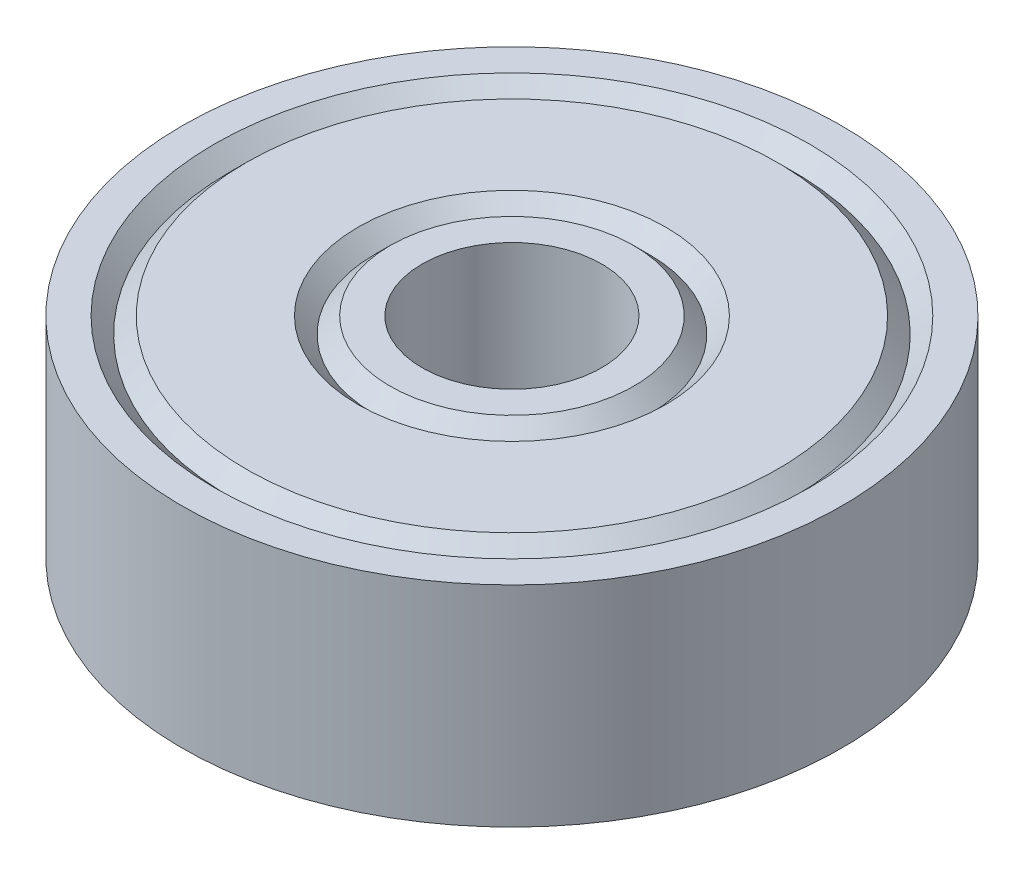
ISO-10303-21;
HEADER;
FILE_DESCRIPTION(('STEP AP214'),'2;1');
FILE_NAME('part.step','',(''),(''),'','','');
FILE_SCHEMA(('AUTOMOTIVE_DESIGN { 1 0 10303 214 1 1 1 1 }'));
ENDSEC;
DATA;
#1=APPLICATION_CONTEXT('core data for automotive mechanical design processes');
#2=APPLICATION_PROTOCOL_DEFINITION('international standard','automotive_design',2000,#1);
#3=PRODUCT_CONTEXT('',#1,'mechanical');
#4=PRODUCT('Part','Part','',(#3));
#5=PRODUCT_RELATED_PRODUCT_CATEGORY('part','',(#4));
#6=PRODUCT_DEFINITION_FORMATION('','',#4);
#7=PRODUCT_DEFINITION_CONTEXT('part definition',#1,'design');
#8=PRODUCT_DEFINITION('design','',#6,#7);
#9=PRODUCT_DEFINITION_SHAPE('','',#8);
#10=(LENGTH_UNIT() NAMED_UNIT(*) SI_UNIT(.MILLI.,.METRE.));
#11=(NAMED_UNIT(*) PLANE_ANGLE_UNIT() SI_UNIT($,.RADIAN.));
#12=(NAMED_UNIT(*) SI_UNIT($,.STERADIAN.) SOLID_ANGLE_UNIT());
#13=UNCERTAINTY_MEASURE_WITH_UNIT(LENGTH_MEASURE(1.E-05),#10,'distance_accuracy_value','');
#14=(GEOMETRIC_REPRESENTATION_CONTEXT(3) GLOBAL_UNCERTAINTY_ASSIGNED_CONTEXT((#13)) GLOBAL_UNIT_ASSIGNED_CONTEXT((#10,
#11,#12)) REPRESENTATION_CONTEXT('',''));
#15=CARTESIAN_POINT('',(0.,0.,0.));
#16=DIRECTION('',(0.,0.,1.));
#17=DIRECTION('',(1.,0.,0.));
#18=AXIS2_PLACEMENT_3D('',#15,#16,#17);
#19=CARTESIAN_POINT('',(0.,3.5,0.));
#20=DIRECTION('',(0.,1.,0.));
#21=DIRECTION('',(-1.,0.,0.));
#22=AXIS2_PLACEMENT_3D('',#19,#20,#21);
#23=CYLINDRICAL_SURFACE('',#22,3.);
#24=CARTESIAN_POINT('',(0.,3.5,0.));
#25=DIRECTION('',(0.,1.,0.));
#26=DIRECTION('',(-1.,0.,0.));
#27=AXIS2_PLACEMENT_3D('',#24,#25,#26);
#28=CIRCLE('',#27,3.);
#29=CARTESIAN_POINT('',(-3.,3.5,0.));
#30=VERTEX_POINT('',#29);
#31=EDGE_CURVE('E83',#30,#30,#28,.T.);
#32=ORIENTED_EDGE('',*,*,#31,.T.);
#33=EDGE_LOOP('',(#32));
#34=FACE_BOUND('',#33,.T.);
#35=CARTESIAN_POINT('',(0.,-3.5,0.));
#36=DIRECTION('',(0.,1.,0.));
#37=DIRECTION('',(-1.,0.,0.));
#38=AXIS2_PLACEMENT_3D('',#35,#36,#37);
#39=CIRCLE('',#38,3.);
#40=CARTESIAN_POINT('',(-3.,-3.5,0.));
#41=VERTEX_POINT('',#40);
#42=EDGE_CURVE('E10',#41,#41,#39,.T.);
#43=ORIENTED_EDGE('',*,*,#42,.F.);
#44=EDGE_LOOP('',(#43));
#45=FACE_BOUND('',#44,.T.);
#46=ADVANCED_FACE('F31',(#34,#45),#23,.F.);
#47=CARTESIAN_POINT('',(-3.,-3.5,0.));
#48=DIRECTION('',(0.,-1.,0.));
#49=DIRECTION('',(1.,0.,0.));
#50=AXIS2_PLACEMENT_3D('',#47,#48,#49);
#51=PLANE('',#50);
#52=ORIENTED_EDGE('',*,*,#42,.T.);
#53=EDGE_LOOP('',(#52));
#54=FACE_BOUND('',#53,.T.);
#55=CARTESIAN_POINT('',(0.,-3.5,0.));
#56=DIRECTION('',(0.,1.,0.));
#57=DIRECTION('',(-1.,0.,0.));
#58=AXIS2_PLACEMENT_3D('',#55,#56,#57);
#59=CIRCLE('',#58,4.06666666666667);
#60=CARTESIAN_POINT('',(-4.06666666666667,-3.5,0.));
#61=VERTEX_POINT('',#60);
#62=EDGE_CURVE('E37',#61,#61,#59,.T.);
#63=ORIENTED_EDGE('',*,*,#62,.F.);
#64=EDGE_LOOP('',(#63));
#65=FACE_BOUND('',#64,.T.);
#66=ADVANCED_FACE('F101',(#54,#65),#51,.T.);
#67=CARTESIAN_POINT('',(0.,-2.96666666666667,0.));
#68=DIRECTION('',(0.,1.,0.));
#69=DIRECTION('',(-1.,0.,0.));
#70=AXIS2_PLACEMENT_3D('',#67,#68,#69);
#71=CONICAL_SURFACE('',#70,4.6,0.785398163397448);
#72=ORIENTED_EDGE('',*,*,#62,.T.);
#73=EDGE_LOOP('',(#72));
#74=FACE_BOUND('',#73,.T.);
#75=CARTESIAN_POINT('',(0.,-2.96666666666667,0.));
#76=DIRECTION('',(0.,1.,0.));
#77=DIRECTION('',(-1.,0.,0.));
#78=AXIS2_PLACEMENT_3D('',#75,#76,#77);
#79=CIRCLE('',#78,4.6);
#80=CARTESIAN_POINT('',(-4.6,-2.96666666666667,0.));
#81=VERTEX_POINT('',#80);
#82=EDGE_CURVE('E41',#81,#81,#79,.T.);
#83=ORIENTED_EDGE('',*,*,#82,.F.);
#84=EDGE_LOOP('',(#83));
#85=FACE_BOUND('',#84,.T.);
#86=ADVANCED_FACE('F105',(#74,#85),#71,.T.);
#87=CARTESIAN_POINT('',(0.,-3.5,0.));
#88=DIRECTION('',(0.,-1.,0.));
#89=DIRECTION('',(1.,0.,0.));
#90=AXIS2_PLACEMENT_3D('',#87,#88,#89);
#91=CONICAL_SURFACE('',#90,5.13333333333333,0.785398163397447);
#92=ORIENTED_EDGE('',*,*,#82,.T.);
#93=EDGE_LOOP('',(#92));
#94=FACE_BOUND('',#93,.T.);
#95=CARTESIAN_POINT('',(0.,-3.5,0.));
#96=DIRECTION('',(0.,1.,0.));
#97=DIRECTION('',(-1.,0.,0.));
#98=AXIS2_PLACEMENT_3D('',#95,#96,#97);
#99=CIRCLE('',#98,5.13333333333333);
#100=CARTESIAN_POINT('',(-5.13333333333333,-3.5,0.));
#101=VERTEX_POINT('',#100);
#102=EDGE_CURVE('E45',#101,#101,#99,.T.);
#103=ORIENTED_EDGE('',*,*,#102,.F.);
#104=EDGE_LOOP('',(#103));
#105=FACE_BOUND('',#104,.T.);
#106=ADVANCED_FACE('F109',(#94,#105),#91,.F.);
#107=CARTESIAN_POINT('',(-5.13333333333333,-3.5,0.));
#108=DIRECTION('',(0.,-1.,0.));
#109=DIRECTION('',(1.,0.,0.));
#110=AXIS2_PLACEMENT_3D('',#107,#108,#109);
#111=PLANE('',#110);
#112=ORIENTED_EDGE('',*,*,#102,.T.);
#113=EDGE_LOOP('',(#112));
#114=FACE_BOUND('',#113,.T.);
#115=CARTESIAN_POINT('',(0.,-3.5,0.));
#116=DIRECTION('',(0.,1.,0.));
#117=DIRECTION('',(-1.,0.,0.));
#118=AXIS2_PLACEMENT_3D('',#115,#116,#117);
#119=CIRCLE('',#118,8.86666666666667);
#120=CARTESIAN_POINT('',(-8.86666666666667,-3.5,0.));
#121=VERTEX_POINT('',#120);
#122=EDGE_CURVE('E50',#121,#121,#119,.T.);
#123=ORIENTED_EDGE('',*,*,#122,.F.);
#124=EDGE_LOOP('',(#123));
#125=FACE_BOUND('',#124,.T.);
#126=ADVANCED_FACE('F115',(#114,#125),#111,.T.);
#127=CARTESIAN_POINT('',(0.,-2.96666666666667,0.));
#128=DIRECTION('',(0.,1.,0.));
#129=DIRECTION('',(-1.,0.,0.));
#130=AXIS2_PLACEMENT_3D('',#127,#128,#129);
#131=CONICAL_SURFACE('',#130,9.4,0.78539816339745);
#132=ORIENTED_EDGE('',*,*,#122,.T.);
#133=EDGE_LOOP('',(#132));
#134=FACE_BOUND('',#133,.T.);
#135=CARTESIAN_POINT('',(0.,-2.96666666666667,0.));
#136=DIRECTION('',(0.,1.,0.));
#137=DIRECTION('',(-1.,0.,0.));
#138=AXIS2_PLACEMENT_3D('',#135,#136,#137);
#139=CIRCLE('',#138,9.4);
#140=CARTESIAN_POINT('',(-9.4,-2.96666666666667,0.));
#141=VERTEX_POINT('',#140);
#142=EDGE_CURVE('E53',#141,#141,#139,.T.);
#143=ORIENTED_EDGE('',*,*,#142,.F.);
#144=EDGE_LOOP('',(#143));
#145=FACE_BOUND('',#144,.T.);
#146=ADVANCED_FACE('F119',(#134,#145),#131,.T.);
#147=CARTESIAN_POINT('',(0.,-3.50000000000001,0.));
#148=DIRECTION('',(0.,-1.,0.));
#149=DIRECTION('',(1.,0.,0.));
#150=AXIS2_PLACEMENT_3D('',#147,#148,#149);
#151=CONICAL_SURFACE('',#150,9.93333333333334,0.785398163397453);
#152=ORIENTED_EDGE('',*,*,#142,.T.);
#153=EDGE_LOOP('',(#152));
#154=FACE_BOUND('',#153,.T.);
#155=CARTESIAN_POINT('',(0.,-3.50000000000001,0.));
#156=DIRECTION('',(0.,1.,0.));
#157=DIRECTION('',(-1.,0.,0.));
#158=AXIS2_PLACEMENT_3D('',#155,#156,#157);
#159=CIRCLE('',#158,9.93333333333334);
#160=CARTESIAN_POINT('',(-9.93333333333334,-3.50000000000001,0.));
#161=VERTEX_POINT('',#160);
#162=EDGE_CURVE('E56',#161,#161,#159,.T.);
#163=ORIENTED_EDGE('',*,*,#162,.F.);
#164=EDGE_LOOP('',(#163));
#165=FACE_BOUND('',#164,.T.);
#166=ADVANCED_FACE('F123',(#154,#165),#151,.F.);
#167=CARTESIAN_POINT('',(-9.93333333333334,-3.5,0.));
#168=DIRECTION('',(0.,-1.,0.));
#169=DIRECTION('',(1.,0.,0.));
#170=AXIS2_PLACEMENT_3D('',#167,#168,#169);
#171=PLANE('',#170);
#172=ORIENTED_EDGE('',*,*,#162,.T.);
#173=EDGE_LOOP('',(#172));
#174=FACE_BOUND('',#173,.T.);
#175=CARTESIAN_POINT('',(0.,-3.5,0.));
#176=DIRECTION('',(0.,1.,0.));
#177=DIRECTION('',(-1.,0.,0.));
#178=AXIS2_PLACEMENT_3D('',#175,#176,#177);
#179=CIRCLE('',#178,11.);
#180=CARTESIAN_POINT('',(-11.,-3.5,0.));
#181=VERTEX_POINT('',#180);
#182=EDGE_CURVE('E59',#181,#181,#179,.T.);
#183=ORIENTED_EDGE('',*,*,#182,.F.);
#184=EDGE_LOOP('',(#183));
#185=FACE_BOUND('',#184,.T.);
#186=ADVANCED_FACE('F127',(#174,#185),#171,.T.);
#187=CARTESIAN_POINT('',(0.,3.5,0.));
#188=DIRECTION('',(0.,1.,0.));
#189=DIRECTION('',(-1.,0.,0.));
#190=AXIS2_PLACEMENT_3D('',#187,#188,#189);
#191=CYLINDRICAL_SURFACE('',#190,11.);
#192=ORIENTED_EDGE('',*,*,#182,.T.);
#193=EDGE_LOOP('',(#192));
#194=FACE_BOUND('',#193,.T.);
#195=CARTESIAN_POINT('',(0.,3.5,0.));
#196=DIRECTION('',(0.,1.,0.));
#197=DIRECTION('',(-1.,0.,0.));
#198=AXIS2_PLACEMENT_3D('',#195,#196,#197);
#199=CIRCLE('',#198,11.);
#200=CARTESIAN_POINT('',(-11.,3.5,0.));
#201=VERTEX_POINT('',#200);
#202=EDGE_CURVE('E62',#201,#201,#199,.T.);
#203=ORIENTED_EDGE('',*,*,#202,.F.);
#204=EDGE_LOOP('',(#203));
#205=FACE_BOUND('',#204,.T.);
#206=ADVANCED_FACE('F131',(#194,#205),#191,.T.);
#207=CARTESIAN_POINT('',(-9.93333333333334,3.5,0.));
#208=DIRECTION('',(0.,1.,0.));
#209=DIRECTION('',(-1.,0.,0.));
#210=AXIS2_PLACEMENT_3D('',#207,#208,#209);
#211=PLANE('',#210);
#212=ORIENTED_EDGE('',*,*,#202,.T.);
#213=EDGE_LOOP('',(#212));
#214=FACE_BOUND('',#213,.T.);
#215=CARTESIAN_POINT('',(0.,3.5,0.));
#216=DIRECTION('',(0.,1.,0.));
#217=DIRECTION('',(-1.,0.,0.));
#218=AXIS2_PLACEMENT_3D('',#215,#216,#217);
#219=CIRCLE('',#218,9.93333333333334);
#220=CARTESIAN_POINT('',(-9.93333333333334,3.5,0.));
#221=VERTEX_POINT('',#220);
#222=EDGE_CURVE('E65',#221,#221,#219,.T.);
#223=ORIENTED_EDGE('',*,*,#222,.F.);
#224=EDGE_LOOP('',(#223));
#225=FACE_BOUND('',#224,.T.);
#226=ADVANCED_FACE('F135',(#214,#225),#211,.T.);
#227=CARTESIAN_POINT('',(0.,2.96666666666667,0.));
#228=DIRECTION('',(0.,1.,0.));
#229=DIRECTION('',(-1.,0.,0.));
#230=AXIS2_PLACEMENT_3D('',#227,#228,#229);
#231=CONICAL_SURFACE('',#230,9.4,0.785398163397453);
#232=ORIENTED_EDGE('',*,*,#222,.T.);
#233=EDGE_LOOP('',(#232));
#234=FACE_BOUND('',#233,.T.);
#235=CARTESIAN_POINT('',(0.,2.96666666666667,0.));
#236=DIRECTION('',(0.,1.,0.));
#237=DIRECTION('',(-1.,0.,0.));
#238=AXIS2_PLACEMENT_3D('',#235,#236,#237);
#239=CIRCLE('',#238,9.4);
#240=CARTESIAN_POINT('',(-9.4,2.96666666666667,0.));
#241=VERTEX_POINT('',#240);
#242=EDGE_CURVE('E68',#241,#241,#239,.T.);
#243=ORIENTED_EDGE('',*,*,#242,.F.);
#244=EDGE_LOOP('',(#243));
#245=FACE_BOUND('',#244,.T.);
#246=ADVANCED_FACE('F139',(#234,#245),#231,.F.);
#247=CARTESIAN_POINT('',(0.,3.5,0.));
#248=DIRECTION('',(0.,-1.,0.));
#249=DIRECTION('',(1.,0.,0.));
#250=AXIS2_PLACEMENT_3D('',#247,#248,#249);
#251=CONICAL_SURFACE('',#250,8.86666666666667,0.785398163397449);
#252=ORIENTED_EDGE('',*,*,#242,.T.);
#253=EDGE_LOOP('',(#252));
#254=FACE_BOUND('',#253,.T.);
#255=CARTESIAN_POINT('',(0.,3.5,0.));
#256=DIRECTION('',(0.,1.,0.));
#257=DIRECTION('',(-1.,0.,0.));
#258=AXIS2_PLACEMENT_3D('',#255,#256,#257);
#259=CIRCLE('',#258,8.86666666666667);
#260=CARTESIAN_POINT('',(-8.86666666666667,3.5,0.));
#261=VERTEX_POINT('',#260);
#262=EDGE_CURVE('E71',#261,#261,#259,.T.);
#263=ORIENTED_EDGE('',*,*,#262,.F.);
#264=EDGE_LOOP('',(#263));
#265=FACE_BOUND('',#264,.T.);
#266=ADVANCED_FACE('F143',(#254,#265),#251,.T.);
#267=CARTESIAN_POINT('',(-5.13333333333333,3.5,0.));
#268=DIRECTION('',(0.,1.,0.));
#269=DIRECTION('',(-1.,0.,0.));
#270=AXIS2_PLACEMENT_3D('',#267,#268,#269);
#271=PLANE('',#270);
#272=ORIENTED_EDGE('',*,*,#262,.T.);
#273=EDGE_LOOP('',(#272));
#274=FACE_BOUND('',#273,.T.);
#275=CARTESIAN_POINT('',(0.,3.5,0.));
#276=DIRECTION('',(0.,1.,0.));
#277=DIRECTION('',(-1.,0.,0.));
#278=AXIS2_PLACEMENT_3D('',#275,#276,#277);
#279=CIRCLE('',#278,5.13333333333333);
#280=CARTESIAN_POINT('',(-5.13333333333333,3.5,0.));
#281=VERTEX_POINT('',#280);
#282=EDGE_CURVE('E74',#281,#281,#279,.T.);
#283=ORIENTED_EDGE('',*,*,#282,.F.);
#284=EDGE_LOOP('',(#283));
#285=FACE_BOUND('',#284,.T.);
#286=ADVANCED_FACE('F147',(#274,#285),#271,.T.);
#287=CARTESIAN_POINT('',(0.,2.96666666666667,0.));
#288=DIRECTION('',(0.,1.,0.));
#289=DIRECTION('',(-1.,0.,0.));
#290=AXIS2_PLACEMENT_3D('',#287,#288,#289);
#291=CONICAL_SURFACE('',#290,4.6,0.785398163397448);
#292=ORIENTED_EDGE('',*,*,#282,.T.);
#293=EDGE_LOOP('',(#292));
#294=FACE_BOUND('',#293,.T.);
#295=CARTESIAN_POINT('',(0.,2.96666666666667,0.));
#296=DIRECTION('',(0.,1.,0.));
#297=DIRECTION('',(-1.,0.,0.));
#298=AXIS2_PLACEMENT_3D('',#295,#296,#297);
#299=CIRCLE('',#298,4.6);
#300=CARTESIAN_POINT('',(-4.6,2.96666666666667,0.));
#301=VERTEX_POINT('',#300);
#302=EDGE_CURVE('E77',#301,#301,#299,.T.);
#303=ORIENTED_EDGE('',*,*,#302,.F.);
#304=EDGE_LOOP('',(#303));
#305=FACE_BOUND('',#304,.T.);
#306=ADVANCED_FACE('F97',(#294,#305),#291,.F.);
#307=CARTESIAN_POINT('',(0.,3.5,0.));
#308=DIRECTION('',(0.,-1.,0.));
#309=DIRECTION('',(1.,0.,0.));
#310=AXIS2_PLACEMENT_3D('',#307,#308,#309);
#311=CONICAL_SURFACE('',#310,4.06666666666667,0.785398163397448);
#312=ORIENTED_EDGE('',*,*,#302,.T.);
#313=EDGE_LOOP('',(#312));
#314=FACE_BOUND('',#313,.T.);
#315=CARTESIAN_POINT('',(0.,3.5,0.));
#316=DIRECTION('',(0.,1.,0.));
#317=DIRECTION('',(-1.,0.,0.));
#318=AXIS2_PLACEMENT_3D('',#315,#316,#317);
#319=CIRCLE('',#318,4.06666666666667);
#320=CARTESIAN_POINT('',(-4.06666666666667,3.5,0.));
#321=VERTEX_POINT('',#320);
#322=EDGE_CURVE('E80',#321,#321,#319,.T.);
#323=ORIENTED_EDGE('',*,*,#322,.F.);
#324=EDGE_LOOP('',(#323));
#325=FACE_BOUND('',#324,.T.);
#326=ADVANCED_FACE('F91',(#314,#325),#311,.T.);
#327=CARTESIAN_POINT('',(-3.,3.5,0.));
#328=DIRECTION('',(0.,1.,0.));
#329=DIRECTION('',(-1.,0.,0.));
#330=AXIS2_PLACEMENT_3D('',#327,#328,#329);
#331=PLANE('',#330);
#332=ORIENTED_EDGE('',*,*,#322,.T.);
#333=EDGE_LOOP('',(#332));
#334=FACE_BOUND('',#333,.T.);
#335=ORIENTED_EDGE('',*,*,#31,.F.);
#336=EDGE_LOOP('',(#335));
#337=FACE_BOUND('',#336,.T.);
#338=ADVANCED_FACE('F89',(#334,#337),#331,.T.);
#339=CLOSED_SHELL('',(#46,#66,#86,#106,#126,#146,#166,#186,#206,#226,#246,#266,#286,#306,#326,#338));
#340=MANIFOLD_SOLID_BREP('B2',#339);
#341=ADVANCED_BREP_SHAPE_REPRESENTATION('',(#18,#340),#14);
#342=SHAPE_DEFINITION_REPRESENTATION(#9,#341);
ENDSEC;
END-ISO-10303-21;
